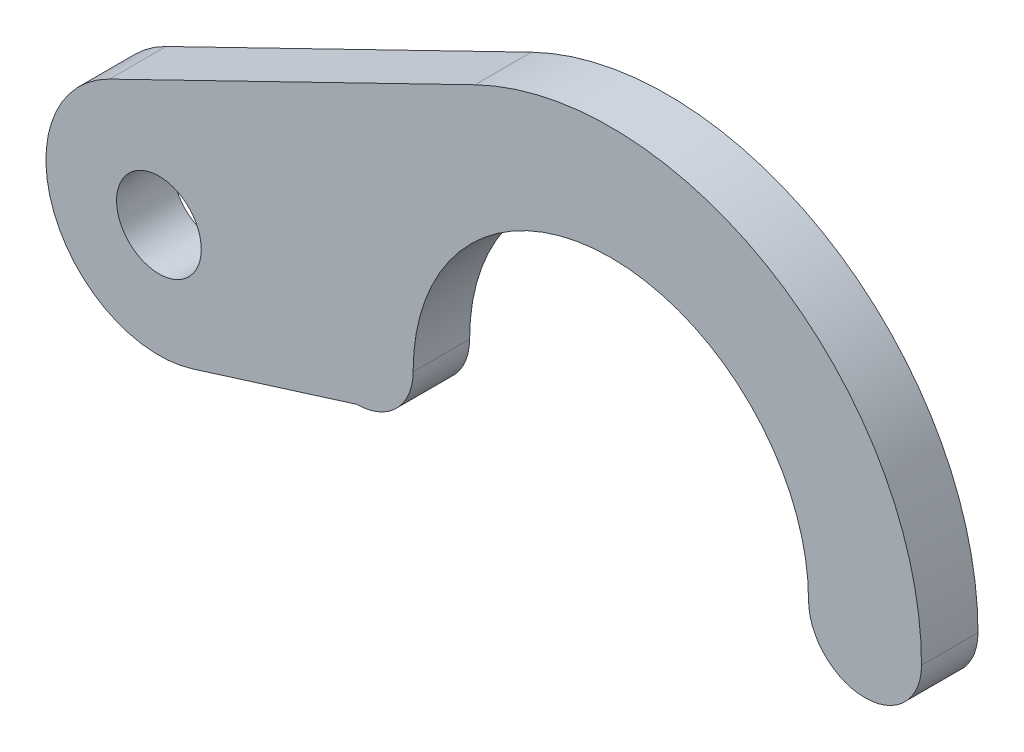
ISO-10303-21;
HEADER;
FILE_DESCRIPTION(('STEP AP214'),'2;1');
FILE_NAME('part.step','',(''),(''),'','','');
FILE_SCHEMA(('AUTOMOTIVE_DESIGN { 1 0 10303 214 1 1 1 1 }'));
ENDSEC;
DATA;
#1=APPLICATION_CONTEXT('core data for automotive mechanical design processes');
#2=APPLICATION_PROTOCOL_DEFINITION('international standard','automotive_design',2000,#1);
#3=PRODUCT_CONTEXT('',#1,'mechanical');
#4=PRODUCT('Part','Part','',(#3));
#5=PRODUCT_RELATED_PRODUCT_CATEGORY('part','',(#4));
#6=PRODUCT_DEFINITION_FORMATION('','',#4);
#7=PRODUCT_DEFINITION_CONTEXT('part definition',#1,'design');
#8=PRODUCT_DEFINITION('design','',#6,#7);
#9=PRODUCT_DEFINITION_SHAPE('','',#8);
#10=(LENGTH_UNIT() NAMED_UNIT(*) SI_UNIT(.MILLI.,.METRE.));
#11=(NAMED_UNIT(*) PLANE_ANGLE_UNIT() SI_UNIT($,.RADIAN.));
#12=(NAMED_UNIT(*) SI_UNIT($,.STERADIAN.) SOLID_ANGLE_UNIT());
#13=UNCERTAINTY_MEASURE_WITH_UNIT(LENGTH_MEASURE(1.E-05),#10,'distance_accuracy_value','');
#14=(GEOMETRIC_REPRESENTATION_CONTEXT(3) GLOBAL_UNCERTAINTY_ASSIGNED_CONTEXT((#13)) GLOBAL_UNIT_ASSIGNED_CONTEXT((#10,
#11,#12)) REPRESENTATION_CONTEXT('',''));
#15=CARTESIAN_POINT('',(0.,0.,0.));
#16=DIRECTION('',(0.,0.,1.));
#17=DIRECTION('',(1.,0.,0.));
#18=AXIS2_PLACEMENT_3D('',#15,#16,#17);
#19=CARTESIAN_POINT('',(28.575,0.,6.35));
#20=DIRECTION('',(0.,0.,1.));
#21=DIRECTION('',(1.,0.,0.));
#22=AXIS2_PLACEMENT_3D('',#19,#20,#21);
#23=PLANE('',#22);
#24=CARTESIAN_POINT('',(28.575,0.,6.35));
#25=DIRECTION('',(0.,0.,1.));
#26=DIRECTION('',(1.,0.,0.));
#27=AXIS2_PLACEMENT_3D('',#24,#25,#26);
#28=CIRCLE('',#27,6.35);
#29=CARTESIAN_POINT('',(22.225,0.,6.35));
#30=VERTEX_POINT('',#29);
#31=CARTESIAN_POINT('',(34.925,0.,6.35));
#32=VERTEX_POINT('',#31);
#33=EDGE_CURVE('E144',#30,#32,#28,.T.);
#34=ORIENTED_EDGE('',*,*,#33,.T.);
#35=CARTESIAN_POINT('',(0.,0.,6.35));
#36=DIRECTION('',(0.,0.,1.));
#37=DIRECTION('',(1.,0.,0.));
#38=AXIS2_PLACEMENT_3D('',#35,#36,#37);
#39=CIRCLE('',#38,34.925);
#40=CARTESIAN_POINT('',(-15.2796875,31.4052029909431,6.35));
#41=VERTEX_POINT('',#40);
#42=EDGE_CURVE('E97',#32,#41,#39,.T.);
#43=ORIENTED_EDGE('',*,*,#42,.T.);
#44=DIRECTION('',(-0.899218410621135,-0.4375,0.));
#45=VECTOR('',#44,1.);
#46=CARTESIAN_POINT('',(-56.35625,11.4200738148884,6.35));
#47=LINE('',#46,#45);
#48=CARTESIAN_POINT('',(-56.35625,11.4200738148884,6.35));
#49=VERTEX_POINT('',#48);
#50=EDGE_CURVE('E156',#41,#49,#47,.T.);
#51=ORIENTED_EDGE('',*,*,#50,.T.);
#52=CARTESIAN_POINT('',(-50.8,0.,6.35));
#53=DIRECTION('',(0.,0.,1.));
#54=DIRECTION('',(1.,0.,0.));
#55=AXIS2_PLACEMENT_3D('',#52,#53,#54);
#56=CIRCLE('',#55,12.7);
#57=CARTESIAN_POINT('',(-47.0057012881052,-12.1199545083681,6.35));
#58=VERTEX_POINT('',#57);
#59=EDGE_CURVE('E113',#49,#58,#56,.T.);
#60=ORIENTED_EDGE('',*,*,#59,.T.);
#61=DIRECTION('',(0.954327126643161,0.298763678101954,0.));
#62=VECTOR('',#61,1.);
#63=CARTESIAN_POINT('',(-47.0057012881052,-12.1199545083681,6.35));
#64=LINE('',#63,#62);
#65=CARTESIAN_POINT('',(-28.575,-6.35,6.35));
#66=VERTEX_POINT('',#65);
#67=EDGE_CURVE('E107',#58,#66,#64,.T.);
#68=ORIENTED_EDGE('',*,*,#67,.T.);
#69=CARTESIAN_POINT('',(-28.575,0.,6.35));
#70=DIRECTION('',(0.,0.,1.));
#71=DIRECTION('',(1.,0.,0.));
#72=AXIS2_PLACEMENT_3D('',#69,#70,#71);
#73=CIRCLE('',#72,6.35);
#74=CARTESIAN_POINT('',(-22.225,0.,6.35));
#75=VERTEX_POINT('',#74);
#76=EDGE_CURVE('E111',#66,#75,#73,.T.);
#77=ORIENTED_EDGE('',*,*,#76,.T.);
#78=CARTESIAN_POINT('',(0.,0.,6.35));
#79=DIRECTION('',(0.,0.,-1.));
#80=DIRECTION('',(1.,0.,0.));
#81=AXIS2_PLACEMENT_3D('',#78,#79,#80);
#82=CIRCLE('',#81,22.225);
#83=EDGE_CURVE('E57',#75,#30,#82,.T.);
#84=ORIENTED_EDGE('',*,*,#83,.T.);
#85=EDGE_LOOP('',(#34,#43,#51,#60,#68,#77,#84));
#86=FACE_BOUND('',#85,.T.);
#87=CARTESIAN_POINT('',(-50.8,0.,6.35));
#88=DIRECTION('',(0.,0.,1.));
#89=DIRECTION('',(1.,0.,0.));
#90=AXIS2_PLACEMENT_3D('',#87,#88,#89);
#91=CIRCLE('',#90,4.76250000000001);
#92=CARTESIAN_POINT('',(-46.0375,0.,6.35));
#93=VERTEX_POINT('',#92);
#94=EDGE_CURVE('E135',#93,#93,#91,.T.);
#95=ORIENTED_EDGE('',*,*,#94,.F.);
#96=EDGE_LOOP('',(#95));
#97=FACE_BOUND('',#96,.T.);
#98=ADVANCED_FACE('F40',(#86,#97),#23,.T.);
#99=CARTESIAN_POINT('',(28.575,0.,0.));
#100=DIRECTION('',(0.,0.,1.));
#101=DIRECTION('',(1.,0.,0.));
#102=AXIS2_PLACEMENT_3D('',#99,#100,#101);
#103=PLANE('',#102);
#104=CARTESIAN_POINT('',(28.575,0.,0.));
#105=DIRECTION('',(0.,0.,1.));
#106=DIRECTION('',(1.,0.,0.));
#107=AXIS2_PLACEMENT_3D('',#104,#105,#106);
#108=CIRCLE('',#107,6.35);
#109=CARTESIAN_POINT('',(22.225,0.,0.));
#110=VERTEX_POINT('',#109);
#111=CARTESIAN_POINT('',(34.925,0.,0.));
#112=VERTEX_POINT('',#111);
#113=EDGE_CURVE('E131',#110,#112,#108,.T.);
#114=ORIENTED_EDGE('',*,*,#113,.F.);
#115=CARTESIAN_POINT('',(0.,0.,0.));
#116=DIRECTION('',(0.,0.,-1.));
#117=DIRECTION('',(1.,0.,0.));
#118=AXIS2_PLACEMENT_3D('',#115,#116,#117);
#119=CIRCLE('',#118,22.225);
#120=CARTESIAN_POINT('',(-22.225,0.,0.));
#121=VERTEX_POINT('',#120);
#122=EDGE_CURVE('E89',#121,#110,#119,.T.);
#123=ORIENTED_EDGE('',*,*,#122,.F.);
#124=CARTESIAN_POINT('',(-28.575,0.,0.));
#125=DIRECTION('',(0.,0.,1.));
#126=DIRECTION('',(1.,0.,0.));
#127=AXIS2_PLACEMENT_3D('',#124,#125,#126);
#128=CIRCLE('',#127,6.35);
#129=CARTESIAN_POINT('',(-28.575,-6.35,0.));
#130=VERTEX_POINT('',#129);
#131=EDGE_CURVE('E83',#130,#121,#128,.T.);
#132=ORIENTED_EDGE('',*,*,#131,.F.);
#133=DIRECTION('',(0.954327126643161,0.298763678101954,0.));
#134=VECTOR('',#133,1.);
#135=CARTESIAN_POINT('',(-47.0057012881052,-12.1199545083681,0.));
#136=LINE('',#135,#134);
#137=CARTESIAN_POINT('',(-47.0057012881052,-12.1199545083681,0.));
#138=VERTEX_POINT('',#137);
#139=EDGE_CURVE('E121',#138,#130,#136,.T.);
#140=ORIENTED_EDGE('',*,*,#139,.F.);
#141=CARTESIAN_POINT('',(-50.8,0.,0.));
#142=DIRECTION('',(0.,0.,1.));
#143=DIRECTION('',(1.,0.,0.));
#144=AXIS2_PLACEMENT_3D('',#141,#142,#143);
#145=CIRCLE('',#144,12.7);
#146=CARTESIAN_POINT('',(-56.35625,11.4200738148884,0.));
#147=VERTEX_POINT('',#146);
#148=EDGE_CURVE('E139',#147,#138,#145,.T.);
#149=ORIENTED_EDGE('',*,*,#148,.F.);
#150=DIRECTION('',(-0.899218410621135,-0.4375,0.));
#151=VECTOR('',#150,1.);
#152=CARTESIAN_POINT('',(-56.35625,11.4200738148884,0.));
#153=LINE('',#152,#151);
#154=CARTESIAN_POINT('',(-15.2796875,31.4052029909431,0.));
#155=VERTEX_POINT('',#154);
#156=EDGE_CURVE('E137',#155,#147,#153,.T.);
#157=ORIENTED_EDGE('',*,*,#156,.F.);
#158=CARTESIAN_POINT('',(0.,0.,0.));
#159=DIRECTION('',(0.,0.,1.));
#160=DIRECTION('',(1.,0.,0.));
#161=AXIS2_PLACEMENT_3D('',#158,#159,#160);
#162=CIRCLE('',#161,34.925);
#163=EDGE_CURVE('E134',#112,#155,#162,.T.);
#164=ORIENTED_EDGE('',*,*,#163,.F.);
#165=EDGE_LOOP('',(#114,#123,#132,#140,#149,#157,#164));
#166=FACE_BOUND('',#165,.T.);
#167=CARTESIAN_POINT('',(-50.8,0.,0.));
#168=DIRECTION('',(0.,0.,1.));
#169=DIRECTION('',(1.,0.,0.));
#170=AXIS2_PLACEMENT_3D('',#167,#168,#169);
#171=CIRCLE('',#170,4.76250000000001);
#172=CARTESIAN_POINT('',(-46.0375,0.,0.));
#173=VERTEX_POINT('',#172);
#174=EDGE_CURVE('E168',#173,#173,#171,.T.);
#175=ORIENTED_EDGE('',*,*,#174,.T.);
#176=EDGE_LOOP('',(#175));
#177=FACE_BOUND('',#176,.T.);
#178=ADVANCED_FACE('F160',(#166,#177),#103,.F.);
#179=CARTESIAN_POINT('',(28.575,0.,6.35));
#180=DIRECTION('',(0.,0.,-1.));
#181=DIRECTION('',(-1.,0.,0.));
#182=AXIS2_PLACEMENT_3D('',#179,#180,#181);
#183=CYLINDRICAL_SURFACE('',#182,6.35);
#184=ORIENTED_EDGE('',*,*,#113,.T.);
#185=DIRECTION('',(0.,0.,-1.));
#186=VECTOR('',#185,1.);
#187=CARTESIAN_POINT('',(34.925,0.,6.35));
#188=LINE('',#187,#186);
#189=EDGE_CURVE('E11',#32,#112,#188,.T.);
#190=ORIENTED_EDGE('',*,*,#189,.F.);
#191=ORIENTED_EDGE('',*,*,#33,.F.);
#192=DIRECTION('',(0.,0.,-1.));
#193=VECTOR('',#192,1.);
#194=CARTESIAN_POINT('',(22.225,0.,6.35));
#195=LINE('',#194,#193);
#196=EDGE_CURVE('E127',#30,#110,#195,.T.);
#197=ORIENTED_EDGE('',*,*,#196,.T.);
#198=EDGE_LOOP('',(#184,#190,#191,#197));
#199=FACE_BOUND('',#198,.T.);
#200=ADVANCED_FACE('F42',(#199),#183,.T.);
#201=CARTESIAN_POINT('',(0.,0.,6.35));
#202=DIRECTION('',(0.,0.,-1.));
#203=DIRECTION('',(-1.,0.,0.));
#204=AXIS2_PLACEMENT_3D('',#201,#202,#203);
#205=CYLINDRICAL_SURFACE('',#204,34.925);
#206=ORIENTED_EDGE('',*,*,#163,.T.);
#207=DIRECTION('',(0.,0.,-1.));
#208=VECTOR('',#207,1.);
#209=CARTESIAN_POINT('',(-15.2796875,31.4052029909431,6.35));
#210=LINE('',#209,#208);
#211=EDGE_CURVE('E49',#41,#155,#210,.T.);
#212=ORIENTED_EDGE('',*,*,#211,.F.);
#213=ORIENTED_EDGE('',*,*,#42,.F.);
#214=ORIENTED_EDGE('',*,*,#189,.T.);
#215=EDGE_LOOP('',(#206,#212,#213,#214));
#216=FACE_BOUND('',#215,.T.);
#217=ADVANCED_FACE('F194',(#216),#205,.T.);
#218=CARTESIAN_POINT('',(-56.35625,11.4200738148884,6.35));
#219=DIRECTION('',(0.4375,-0.899218410621135,0.));
#220=DIRECTION('',(0.899218410621135,0.4375,0.));
#221=AXIS2_PLACEMENT_3D('',#218,#219,#220);
#222=PLANE('',#221);
#223=ORIENTED_EDGE('',*,*,#156,.T.);
#224=DIRECTION('',(0.,0.,-1.));
#225=VECTOR('',#224,1.);
#226=CARTESIAN_POINT('',(-56.35625,11.4200738148884,6.35));
#227=LINE('',#226,#225);
#228=EDGE_CURVE('E148',#49,#147,#227,.T.);
#229=ORIENTED_EDGE('',*,*,#228,.F.);
#230=ORIENTED_EDGE('',*,*,#50,.F.);
#231=ORIENTED_EDGE('',*,*,#211,.T.);
#232=EDGE_LOOP('',(#223,#229,#230,#231));
#233=FACE_BOUND('',#232,.T.);
#234=ADVANCED_FACE('F154',(#233),#222,.F.);
#235=CARTESIAN_POINT('',(-50.8,0.,6.35));
#236=DIRECTION('',(0.,0.,-1.));
#237=DIRECTION('',(-1.,0.,0.));
#238=AXIS2_PLACEMENT_3D('',#235,#236,#237);
#239=CYLINDRICAL_SURFACE('',#238,12.7);
#240=ORIENTED_EDGE('',*,*,#148,.T.);
#241=DIRECTION('',(0.,0.,-1.));
#242=VECTOR('',#241,1.);
#243=CARTESIAN_POINT('',(-47.0057012881052,-12.1199545083681,6.35));
#244=LINE('',#243,#242);
#245=EDGE_CURVE('E122',#58,#138,#244,.T.);
#246=ORIENTED_EDGE('',*,*,#245,.F.);
#247=ORIENTED_EDGE('',*,*,#59,.F.);
#248=ORIENTED_EDGE('',*,*,#228,.T.);
#249=EDGE_LOOP('',(#240,#246,#247,#248));
#250=FACE_BOUND('',#249,.T.);
#251=ADVANCED_FACE('F163',(#250),#239,.T.);
#252=CARTESIAN_POINT('',(-47.0057012881052,-12.1199545083681,6.35));
#253=DIRECTION('',(-0.298763678101954,0.954327126643161,0.));
#254=DIRECTION('',(-0.954327126643161,-0.298763678101954,0.));
#255=AXIS2_PLACEMENT_3D('',#252,#253,#254);
#256=PLANE('',#255);
#257=ORIENTED_EDGE('',*,*,#139,.T.);
#258=DIRECTION('',(0.,0.,-1.));
#259=VECTOR('',#258,1.);
#260=CARTESIAN_POINT('',(-28.575,-6.35,6.35));
#261=LINE('',#260,#259);
#262=EDGE_CURVE('E118',#66,#130,#261,.T.);
#263=ORIENTED_EDGE('',*,*,#262,.F.);
#264=ORIENTED_EDGE('',*,*,#67,.F.);
#265=ORIENTED_EDGE('',*,*,#245,.T.);
#266=EDGE_LOOP('',(#257,#263,#264,#265));
#267=FACE_BOUND('',#266,.T.);
#268=ADVANCED_FACE('F119',(#267),#256,.F.);
#269=CARTESIAN_POINT('',(-28.575,0.,6.35));
#270=DIRECTION('',(0.,0.,-1.));
#271=DIRECTION('',(-1.,0.,0.));
#272=AXIS2_PLACEMENT_3D('',#269,#270,#271);
#273=CYLINDRICAL_SURFACE('',#272,6.35);
#274=ORIENTED_EDGE('',*,*,#131,.T.);
#275=DIRECTION('',(0.,0.,-1.));
#276=VECTOR('',#275,1.);
#277=CARTESIAN_POINT('',(-22.225,0.,6.35));
#278=LINE('',#277,#276);
#279=EDGE_CURVE('E123',#75,#121,#278,.T.);
#280=ORIENTED_EDGE('',*,*,#279,.F.);
#281=ORIENTED_EDGE('',*,*,#76,.F.);
#282=ORIENTED_EDGE('',*,*,#262,.T.);
#283=EDGE_LOOP('',(#274,#280,#281,#282));
#284=FACE_BOUND('',#283,.T.);
#285=ADVANCED_FACE('F125',(#284),#273,.T.);
#286=CARTESIAN_POINT('',(0.,0.,6.35));
#287=DIRECTION('',(0.,0.,-1.));
#288=DIRECTION('',(-1.,0.,0.));
#289=AXIS2_PLACEMENT_3D('',#286,#287,#288);
#290=CYLINDRICAL_SURFACE('',#289,22.225);
#291=ORIENTED_EDGE('',*,*,#122,.T.);
#292=ORIENTED_EDGE('',*,*,#196,.F.);
#293=ORIENTED_EDGE('',*,*,#83,.F.);
#294=ORIENTED_EDGE('',*,*,#279,.T.);
#295=EDGE_LOOP('',(#291,#292,#293,#294));
#296=FACE_BOUND('',#295,.T.);
#297=ADVANCED_FACE('F184',(#296),#290,.F.);
#298=CARTESIAN_POINT('',(-50.8,0.,6.35));
#299=DIRECTION('',(0.,0.,-1.));
#300=DIRECTION('',(-1.,0.,0.));
#301=AXIS2_PLACEMENT_3D('',#298,#299,#300);
#302=CYLINDRICAL_SURFACE('',#301,4.76250000000001);
#303=ORIENTED_EDGE('',*,*,#94,.T.);
#304=EDGE_LOOP('',(#303));
#305=FACE_BOUND('',#304,.T.);
#306=ORIENTED_EDGE('',*,*,#174,.F.);
#307=EDGE_LOOP('',(#306));
#308=FACE_BOUND('',#307,.T.);
#309=ADVANCED_FACE('F174',(#305,#308),#302,.F.);
#310=CLOSED_SHELL('',(#98,#178,#200,#217,#234,#251,#268,#285,#297,#309));
#311=MANIFOLD_SOLID_BREP('B2',#310);
#312=ADVANCED_BREP_SHAPE_REPRESENTATION('',(#18,#311),#14);
#313=SHAPE_DEFINITION_REPRESENTATION(#9,#312);
ENDSEC;
END-ISO-10303-21;
